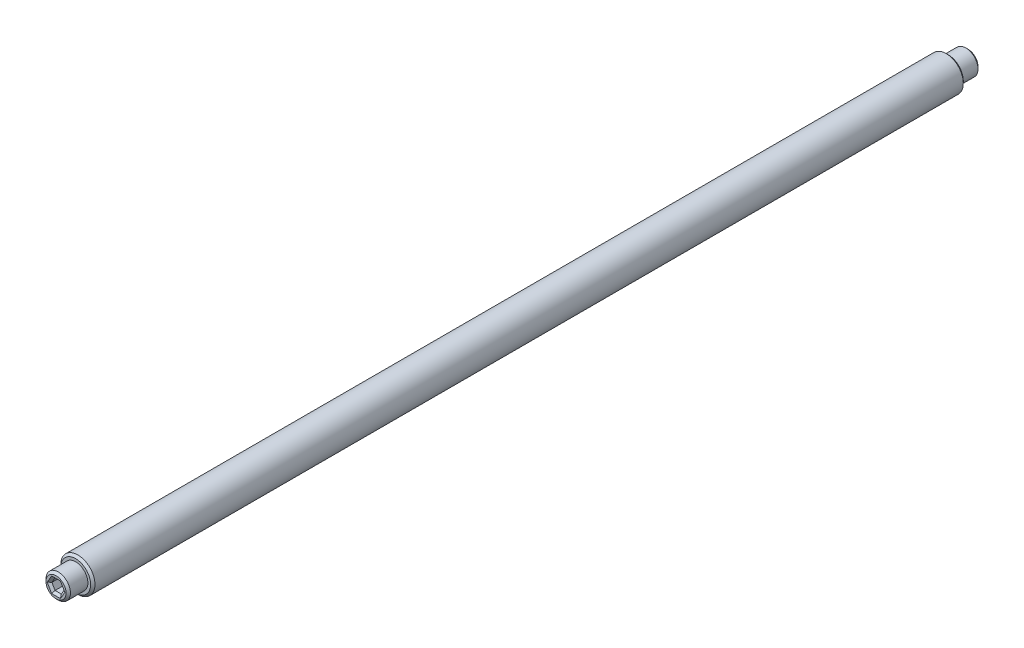
ISO-10303-21;
HEADER;
FILE_DESCRIPTION(('STEP AP214'),'2;1');
FILE_NAME('part.step','',(''),(''),'','','');
FILE_SCHEMA(('AUTOMOTIVE_DESIGN { 1 0 10303 214 1 1 1 1 }'));
ENDSEC;
DATA;
#1=APPLICATION_CONTEXT('core data for automotive mechanical design processes');
#2=APPLICATION_PROTOCOL_DEFINITION('international standard','automotive_design',2000,#1);
#3=PRODUCT_CONTEXT('',#1,'mechanical');
#4=PRODUCT('Part','Part','',(#3));
#5=PRODUCT_RELATED_PRODUCT_CATEGORY('part','',(#4));
#6=PRODUCT_DEFINITION_FORMATION('','',#4);
#7=PRODUCT_DEFINITION_CONTEXT('part definition',#1,'design');
#8=PRODUCT_DEFINITION('design','',#6,#7);
#9=PRODUCT_DEFINITION_SHAPE('','',#8);
#10=(LENGTH_UNIT() NAMED_UNIT(*) SI_UNIT(.MILLI.,.METRE.));
#11=(NAMED_UNIT(*) PLANE_ANGLE_UNIT() SI_UNIT($,.RADIAN.));
#12=(NAMED_UNIT(*) SI_UNIT($,.STERADIAN.) SOLID_ANGLE_UNIT());
#13=UNCERTAINTY_MEASURE_WITH_UNIT(LENGTH_MEASURE(1.E-05),#10,'distance_accuracy_value','');
#14=(GEOMETRIC_REPRESENTATION_CONTEXT(3) GLOBAL_UNCERTAINTY_ASSIGNED_CONTEXT((#13)) GLOBAL_UNIT_ASSIGNED_CONTEXT((#10,
#11,#12)) REPRESENTATION_CONTEXT('',''));
#15=CARTESIAN_POINT('',(0.,0.,0.));
#16=DIRECTION('',(0.,0.,1.));
#17=DIRECTION('',(1.,0.,0.));
#18=AXIS2_PLACEMENT_3D('',#15,#16,#17);
#19=CARTESIAN_POINT('',(-1.4224,0.,46.736));
#20=DIRECTION('',(0.,0.,1.));
#21=DIRECTION('',(0.,-1.,0.));
#22=AXIS2_PLACEMENT_3D('',#19,#20,#21);
#23=PLANE('',#22);
#24=CARTESIAN_POINT('',(0.,0.,46.736));
#25=DIRECTION('',(0.,0.,1.));
#26=DIRECTION('',(0.,-1.,0.));
#27=AXIS2_PLACEMENT_3D('',#24,#25,#26);
#28=CIRCLE('',#27,1.1684);
#29=CARTESIAN_POINT('',(0.,-1.1684,46.736));
#30=VERTEX_POINT('',#29);
#31=EDGE_CURVE('P0_E126',#30,#30,#28,.F.);
#32=ORIENTED_EDGE('',*,*,#31,.T.);
#33=EDGE_LOOP('',(#32));
#34=FACE_BOUND('',#33,.T.);
#35=ADVANCED_FACE('P0_F16',(#34),#23,.F.);
#36=CARTESIAN_POINT('',(0.,0.,53.086));
#37=DIRECTION('',(0.,0.,-1.));
#38=DIRECTION('',(0.,1.,0.));
#39=AXIS2_PLACEMENT_3D('',#36,#37,#38);
#40=PLANE('',#39);
#41=DIRECTION('',(0.5,-0.866025403784439,0.));
#42=VECTOR('',#41,1.);
#43=CARTESIAN_POINT('',(0.769896583964369,0.444499999999998,53.086));
#44=LINE('',#43,#42);
#45=CARTESIAN_POINT('',(0.513264389309577,0.889000000000003,53.086));
#46=VERTEX_POINT('',#45);
#47=CARTESIAN_POINT('',(1.02652877861916,0.,53.086));
#48=VERTEX_POINT('',#47);
#49=EDGE_CURVE('P0_E157',#46,#48,#44,.T.);
#50=ORIENTED_EDGE('',*,*,#49,.T.);
#51=DIRECTION('',(-0.5,-0.866025403784439,0.));
#52=VECTOR('',#51,1.);
#53=CARTESIAN_POINT('',(0.769896583964379,-0.444500000000007,53.086));
#54=LINE('',#53,#52);
#55=CARTESIAN_POINT('',(0.513264389309584,-0.889000000000008,53.086));
#56=VERTEX_POINT('',#55);
#57=EDGE_CURVE('P0_E159',#48,#56,#54,.T.);
#58=ORIENTED_EDGE('',*,*,#57,.T.);
#59=DIRECTION('',(-1.,0.,0.));
#60=VECTOR('',#59,1.);
#61=CARTESIAN_POINT('',(0.,-0.889000000000005,53.086));
#62=LINE('',#61,#60);
#63=CARTESIAN_POINT('',(-0.513264389309577,-0.889000000000001,53.086));
#64=VERTEX_POINT('',#63);
#65=EDGE_CURVE('P0_E149',#56,#64,#62,.T.);
#66=ORIENTED_EDGE('',*,*,#65,.T.);
#67=DIRECTION('',(-0.5,0.866025403784439,0.));
#68=VECTOR('',#67,1.);
#69=CARTESIAN_POINT('',(-0.769896583964343,-0.444500000000007,53.086));
#70=LINE('',#69,#68);
#71=CARTESIAN_POINT('',(-1.02652877861915,0.,53.086));
#72=VERTEX_POINT('',#71);
#73=EDGE_CURVE('P0_E151',#64,#72,#70,.T.);
#74=ORIENTED_EDGE('',*,*,#73,.T.);
#75=DIRECTION('',(0.5,0.866025403784439,0.));
#76=VECTOR('',#75,1.);
#77=CARTESIAN_POINT('',(-0.769896583964338,0.444499999999995,53.086));
#78=LINE('',#77,#76);
#79=CARTESIAN_POINT('',(-0.513264389309577,0.889000000000002,53.086));
#80=VERTEX_POINT('',#79);
#81=EDGE_CURVE('P0_E153',#72,#80,#78,.T.);
#82=ORIENTED_EDGE('',*,*,#81,.T.);
#83=DIRECTION('',(1.,0.,0.));
#84=VECTOR('',#83,1.);
#85=CARTESIAN_POINT('',(0.,0.888999999999998,53.086));
#86=LINE('',#85,#84);
#87=EDGE_CURVE('P0_E155',#80,#46,#86,.T.);
#88=ORIENTED_EDGE('',*,*,#87,.T.);
#89=EDGE_LOOP('',(#50,#58,#66,#74,#82,#88));
#90=FACE_BOUND('',#89,.T.);
#91=CARTESIAN_POINT('',(0.,0.,53.086));
#92=DIRECTION('',(0.,0.,-1.));
#93=DIRECTION('',(0.,1.,0.));
#94=AXIS2_PLACEMENT_3D('',#91,#92,#93);
#95=CIRCLE('',#94,1.1684);
#96=CARTESIAN_POINT('',(0.,1.1684,53.086));
#97=VERTEX_POINT('',#96);
#98=EDGE_CURVE('P0_E143',#97,#97,#95,.F.);
#99=ORIENTED_EDGE('',*,*,#98,.T.);
#100=EDGE_LOOP('',(#99));
#101=FACE_BOUND('',#100,.T.);
#102=ADVANCED_FACE('P0_F208',(#90,#101),#40,.F.);
#103=CARTESIAN_POINT('',(0.,0.,46.736));
#104=DIRECTION('',(0.,0.,-1.));
#105=DIRECTION('',(0.,1.,0.));
#106=AXIS2_PLACEMENT_3D('',#103,#104,#105);
#107=CYLINDRICAL_SURFACE('',#106,1.4224);
#108=CARTESIAN_POINT('',(0.,0.,46.99));
#109=DIRECTION('',(0.,0.,1.));
#110=DIRECTION('',(0.,-1.,0.));
#111=AXIS2_PLACEMENT_3D('',#108,#109,#110);
#112=CIRCLE('',#111,1.4224);
#113=CARTESIAN_POINT('',(0.,-1.4224,46.99));
#114=VERTEX_POINT('',#113);
#115=EDGE_CURVE('P0_E140',#114,#114,#112,.T.);
#116=ORIENTED_EDGE('',*,*,#115,.T.);
#117=EDGE_LOOP('',(#116));
#118=FACE_BOUND('',#117,.T.);
#119=CARTESIAN_POINT('',(0.,0.,52.832));
#120=DIRECTION('',(0.,0.,-1.));
#121=DIRECTION('',(0.,1.,0.));
#122=AXIS2_PLACEMENT_3D('',#119,#120,#121);
#123=CIRCLE('',#122,1.4224);
#124=CARTESIAN_POINT('',(0.,1.4224,52.832));
#125=VERTEX_POINT('',#124);
#126=EDGE_CURVE('P0_E137',#125,#125,#123,.T.);
#127=ORIENTED_EDGE('',*,*,#126,.T.);
#128=EDGE_LOOP('',(#127));
#129=FACE_BOUND('',#128,.T.);
#130=ADVANCED_FACE('P0_F211',(#118,#129),#107,.T.);
#131=CARTESIAN_POINT('',(0.,0.,46.736));
#132=DIRECTION('',(0.,0.,1.));
#133=DIRECTION('',(0.,-1.,0.));
#134=AXIS2_PLACEMENT_3D('',#131,#132,#133);
#135=CONICAL_SURFACE('',#134,1.1684,0.785398163397445);
#136=ORIENTED_EDGE('',*,*,#115,.F.);
#137=EDGE_LOOP('',(#136));
#138=FACE_BOUND('',#137,.T.);
#139=ORIENTED_EDGE('',*,*,#31,.F.);
#140=EDGE_LOOP('',(#139));
#141=FACE_BOUND('',#140,.T.);
#142=ADVANCED_FACE('P0_F218',(#138,#141),#135,.T.);
#143=CARTESIAN_POINT('',(0.,0.,52.832));
#144=DIRECTION('',(0.,0.,-1.));
#145=DIRECTION('',(0.,1.,0.));
#146=AXIS2_PLACEMENT_3D('',#143,#144,#145);
#147=CONICAL_SURFACE('',#146,1.4224,0.78539816339745);
#148=ORIENTED_EDGE('',*,*,#98,.F.);
#149=EDGE_LOOP('',(#148));
#150=FACE_BOUND('',#149,.T.);
#151=ORIENTED_EDGE('',*,*,#126,.F.);
#152=EDGE_LOOP('',(#151));
#153=FACE_BOUND('',#152,.T.);
#154=ADVANCED_FACE('P0_F215',(#150,#153),#147,.T.);
#155=CARTESIAN_POINT('',(0.733234841870836,0.,51.816));
#156=DIRECTION('',(0.866025403784439,0.5,0.));
#157=DIRECTION('',(-0.5,0.866025403784439,0.));
#158=AXIS2_PLACEMENT_3D('',#155,#156,#157);
#159=PLANE('',#158);
#160=DIRECTION('',(0.,0.,1.));
#161=VECTOR('',#160,1.);
#162=CARTESIAN_POINT('',(0.733234841870836,0.,51.816));
#163=LINE('',#162,#161);
#164=CARTESIAN_POINT('',(0.733234841870836,0.,51.816));
#165=VERTEX_POINT('',#164);
#166=CARTESIAN_POINT('',(0.733234841870836,0.,52.832));
#167=VERTEX_POINT('',#166);
#168=EDGE_CURVE('P0_E124',#165,#167,#163,.T.);
#169=ORIENTED_EDGE('',*,*,#168,.T.);
#170=DIRECTION('',(-0.5,0.866025403784439,0.));
#171=VECTOR('',#170,1.);
#172=CARTESIAN_POINT('',(0.733234841870836,0.,52.832));
#173=LINE('',#172,#171);
#174=CARTESIAN_POINT('',(0.366617420935418,0.635000000000004,52.832));
#175=VERTEX_POINT('',#174);
#176=EDGE_CURVE('P0_E96',#167,#175,#173,.T.);
#177=ORIENTED_EDGE('',*,*,#176,.T.);
#178=DIRECTION('',(0.,0.,1.));
#179=VECTOR('',#178,1.);
#180=CARTESIAN_POINT('',(0.366617420935418,0.635000000000004,51.816));
#181=LINE('',#180,#179);
#182=CARTESIAN_POINT('',(0.366617420935418,0.635000000000004,51.816));
#183=VERTEX_POINT('',#182);
#184=EDGE_CURVE('P0_E88',#183,#175,#181,.T.);
#185=ORIENTED_EDGE('',*,*,#184,.F.);
#186=DIRECTION('',(-0.5,0.866025403784439,0.));
#187=VECTOR('',#186,1.);
#188=CARTESIAN_POINT('',(0.733234841870836,0.,51.816));
#189=LINE('',#188,#187);
#190=EDGE_CURVE('P0_E93',#165,#183,#189,.T.);
#191=ORIENTED_EDGE('',*,*,#190,.F.);
#192=EDGE_LOOP('',(#169,#177,#185,#191));
#193=FACE_BOUND('',#192,.T.);
#194=ADVANCED_FACE('P0_F91',(#193),#159,.F.);
#195=CARTESIAN_POINT('',(0.366617420935415,-0.634999999999999,51.816));
#196=DIRECTION('',(0.866025403784439,-0.5,0.));
#197=DIRECTION('',(0.5,0.866025403784439,0.));
#198=AXIS2_PLACEMENT_3D('',#195,#196,#197);
#199=PLANE('',#198);
#200=DIRECTION('',(0.,0.,1.));
#201=VECTOR('',#200,1.);
#202=CARTESIAN_POINT('',(0.366617420935415,-0.634999999999999,51.816));
#203=LINE('',#202,#201);
#204=CARTESIAN_POINT('',(0.366617420935415,-0.634999999999999,51.816));
#205=VERTEX_POINT('',#204);
#206=CARTESIAN_POINT('',(0.366617420935415,-0.634999999999999,52.832));
#207=VERTEX_POINT('',#206);
#208=EDGE_CURVE('P0_E127',#205,#207,#203,.T.);
#209=ORIENTED_EDGE('',*,*,#208,.T.);
#210=DIRECTION('',(0.5,0.866025403784439,0.));
#211=VECTOR('',#210,1.);
#212=CARTESIAN_POINT('',(0.366617420935415,-0.634999999999999,52.832));
#213=LINE('',#212,#211);
#214=EDGE_CURVE('P0_E146',#207,#167,#213,.T.);
#215=ORIENTED_EDGE('',*,*,#214,.T.);
#216=ORIENTED_EDGE('',*,*,#168,.F.);
#217=DIRECTION('',(0.5,0.866025403784439,0.));
#218=VECTOR('',#217,1.);
#219=CARTESIAN_POINT('',(0.366617420935415,-0.634999999999999,51.816));
#220=LINE('',#219,#218);
#221=EDGE_CURVE('P0_E100',#205,#165,#220,.T.);
#222=ORIENTED_EDGE('',*,*,#221,.F.);
#223=EDGE_LOOP('',(#209,#215,#216,#222));
#224=FACE_BOUND('',#223,.T.);
#225=ADVANCED_FACE('P0_F199',(#224),#199,.F.);
#226=CARTESIAN_POINT('',(-0.366617420935404,-0.634999999999999,51.816));
#227=DIRECTION('',(0.,-1.,0.));
#228=DIRECTION('',(1.,0.,0.));
#229=AXIS2_PLACEMENT_3D('',#226,#227,#228);
#230=PLANE('',#229);
#231=DIRECTION('',(0.,0.,1.));
#232=VECTOR('',#231,1.);
#233=CARTESIAN_POINT('',(-0.366617420935404,-0.634999999999999,51.816));
#234=LINE('',#233,#232);
#235=CARTESIAN_POINT('',(-0.366617420935404,-0.634999999999999,51.816));
#236=VERTEX_POINT('',#235);
#237=CARTESIAN_POINT('',(-0.366617420935404,-0.634999999999999,52.832));
#238=VERTEX_POINT('',#237);
#239=EDGE_CURVE('P0_E130',#236,#238,#234,.T.);
#240=ORIENTED_EDGE('',*,*,#239,.T.);
#241=DIRECTION('',(1.,0.,0.));
#242=VECTOR('',#241,1.);
#243=CARTESIAN_POINT('',(-0.366617420935404,-0.634999999999999,52.832));
#244=LINE('',#243,#242);
#245=EDGE_CURVE('P0_E11',#238,#207,#244,.T.);
#246=ORIENTED_EDGE('',*,*,#245,.T.);
#247=ORIENTED_EDGE('',*,*,#208,.F.);
#248=DIRECTION('',(1.,0.,0.));
#249=VECTOR('',#248,1.);
#250=CARTESIAN_POINT('',(-0.366617420935404,-0.634999999999999,51.816));
#251=LINE('',#250,#249);
#252=EDGE_CURVE('P0_E121',#236,#205,#251,.T.);
#253=ORIENTED_EDGE('',*,*,#252,.F.);
#254=EDGE_LOOP('',(#240,#246,#247,#253));
#255=FACE_BOUND('',#254,.T.);
#256=ADVANCED_FACE('P0_F196',(#255),#230,.F.);
#257=CARTESIAN_POINT('',(-0.733234841870798,0.,51.816));
#258=DIRECTION('',(-0.866025403784439,-0.5,0.));
#259=DIRECTION('',(0.5,-0.866025403784439,0.));
#260=AXIS2_PLACEMENT_3D('',#257,#258,#259);
#261=PLANE('',#260);
#262=DIRECTION('',(0.,0.,1.));
#263=VECTOR('',#262,1.);
#264=CARTESIAN_POINT('',(-0.733234841870798,0.,51.816));
#265=LINE('',#264,#263);
#266=CARTESIAN_POINT('',(-0.733234841870798,0.,51.816));
#267=VERTEX_POINT('',#266);
#268=CARTESIAN_POINT('',(-0.733234841870798,0.,52.832));
#269=VERTEX_POINT('',#268);
#270=EDGE_CURVE('P0_E132',#267,#269,#265,.T.);
#271=ORIENTED_EDGE('',*,*,#270,.T.);
#272=DIRECTION('',(0.5,-0.866025403784439,0.));
#273=VECTOR('',#272,1.);
#274=CARTESIAN_POINT('',(-0.733234841870798,0.,52.832));
#275=LINE('',#274,#273);
#276=EDGE_CURVE('P0_E25',#269,#238,#275,.T.);
#277=ORIENTED_EDGE('',*,*,#276,.T.);
#278=ORIENTED_EDGE('',*,*,#239,.F.);
#279=DIRECTION('',(0.5,-0.866025403784439,0.));
#280=VECTOR('',#279,1.);
#281=CARTESIAN_POINT('',(-0.733234841870798,0.,51.816));
#282=LINE('',#281,#280);
#283=EDGE_CURVE('P0_E118',#267,#236,#282,.T.);
#284=ORIENTED_EDGE('',*,*,#283,.F.);
#285=EDGE_LOOP('',(#271,#277,#278,#284));
#286=FACE_BOUND('',#285,.T.);
#287=ADVANCED_FACE('P0_F263',(#286),#261,.F.);
#288=CARTESIAN_POINT('',(-0.366617420935404,0.635000000000002,51.816));
#289=DIRECTION('',(-0.866025403784439,0.5,0.));
#290=DIRECTION('',(-0.5,-0.866025403784439,0.));
#291=AXIS2_PLACEMENT_3D('',#288,#289,#290);
#292=PLANE('',#291);
#293=DIRECTION('',(0.,0.,1.));
#294=VECTOR('',#293,1.);
#295=CARTESIAN_POINT('',(-0.366617420935404,0.635000000000002,51.816));
#296=LINE('',#295,#294);
#297=CARTESIAN_POINT('',(-0.366617420935404,0.635000000000002,51.816));
#298=VERTEX_POINT('',#297);
#299=CARTESIAN_POINT('',(-0.366617420935404,0.635000000000002,52.832));
#300=VERTEX_POINT('',#299);
#301=EDGE_CURVE('P0_E99',#298,#300,#296,.T.);
#302=ORIENTED_EDGE('',*,*,#301,.T.);
#303=DIRECTION('',(-0.5,-0.866025403784439,0.));
#304=VECTOR('',#303,1.);
#305=CARTESIAN_POINT('',(-0.366617420935404,0.635000000000002,52.832));
#306=LINE('',#305,#304);
#307=EDGE_CURVE('P0_E40',#300,#269,#306,.T.);
#308=ORIENTED_EDGE('',*,*,#307,.T.);
#309=ORIENTED_EDGE('',*,*,#270,.F.);
#310=DIRECTION('',(-0.5,-0.866025403784439,0.));
#311=VECTOR('',#310,1.);
#312=CARTESIAN_POINT('',(-0.366617420935404,0.635000000000002,51.816));
#313=LINE('',#312,#311);
#314=EDGE_CURVE('P0_E108',#298,#267,#313,.T.);
#315=ORIENTED_EDGE('',*,*,#314,.F.);
#316=EDGE_LOOP('',(#302,#308,#309,#315));
#317=FACE_BOUND('',#316,.T.);
#318=ADVANCED_FACE('P0_F256',(#317),#292,.F.);
#319=CARTESIAN_POINT('',(0.366617420935418,0.635000000000004,51.816));
#320=DIRECTION('',(0.,1.,0.));
#321=DIRECTION('',(-1.,0.,0.));
#322=AXIS2_PLACEMENT_3D('',#319,#320,#321);
#323=PLANE('',#322);
#324=ORIENTED_EDGE('',*,*,#184,.T.);
#325=DIRECTION('',(-1.,0.,0.));
#326=VECTOR('',#325,1.);
#327=CARTESIAN_POINT('',(0.366617420935418,0.635000000000004,52.832));
#328=LINE('',#327,#326);
#329=EDGE_CURVE('P0_E163',#175,#300,#328,.T.);
#330=ORIENTED_EDGE('',*,*,#329,.T.);
#331=ORIENTED_EDGE('',*,*,#301,.F.);
#332=DIRECTION('',(-1.,0.,0.));
#333=VECTOR('',#332,1.);
#334=CARTESIAN_POINT('',(0.366617420935418,0.635000000000004,51.816));
#335=LINE('',#334,#333);
#336=EDGE_CURVE('P0_E103',#183,#298,#335,.T.);
#337=ORIENTED_EDGE('',*,*,#336,.F.);
#338=EDGE_LOOP('',(#324,#330,#331,#337));
#339=FACE_BOUND('',#338,.T.);
#340=ADVANCED_FACE('P0_F104',(#339),#323,.F.);
#341=CARTESIAN_POINT('',(1.09985226280624,-0.635000000000004,51.816));
#342=DIRECTION('',(0.,0.,-1.));
#343=DIRECTION('',(0.,1.,0.));
#344=AXIS2_PLACEMENT_3D('',#341,#342,#343);
#345=PLANE('',#344);
#346=ORIENTED_EDGE('',*,*,#190,.T.);
#347=ORIENTED_EDGE('',*,*,#336,.T.);
#348=ORIENTED_EDGE('',*,*,#314,.T.);
#349=ORIENTED_EDGE('',*,*,#283,.T.);
#350=ORIENTED_EDGE('',*,*,#252,.T.);
#351=ORIENTED_EDGE('',*,*,#221,.T.);
#352=EDGE_LOOP('',(#346,#347,#348,#349,#350,#351));
#353=FACE_BOUND('',#352,.T.);
#354=ADVANCED_FACE('P0_F110',(#353),#345,.F.);
#355=CARTESIAN_POINT('',(-0.366617420935404,0.635000000000002,52.832));
#356=DIRECTION('',(-0.612372435695793,0.353553390593273,-0.707106781186549));
#357=DIRECTION('',(0.755928946018456,0.,-0.654653670707976));
#358=AXIS2_PLACEMENT_3D('',#355,#356,#357);
#359=PLANE('',#358);
#360=DIRECTION('',(-0.377964473009228,0.654653670707978,0.654653670707976));
#361=VECTOR('',#360,1.);
#362=CARTESIAN_POINT('',(-0.261869586382434,0.453571428571433,52.6505714285714));
#363=LINE('',#362,#361);
#364=EDGE_CURVE('P0_E115',#80,#300,#363,.F.);
#365=ORIENTED_EDGE('',*,*,#364,.F.);
#366=ORIENTED_EDGE('',*,*,#81,.F.);
#367=DIRECTION('',(-0.755928946018456,0.,0.654653670707976));
#368=VECTOR('',#367,1.);
#369=CARTESIAN_POINT('',(-0.523739172764874,0.,52.6505714285714));
#370=LINE('',#369,#368);
#371=EDGE_CURVE('P0_E20',#269,#72,#370,.T.);
#372=ORIENTED_EDGE('',*,*,#371,.F.);
#373=ORIENTED_EDGE('',*,*,#307,.F.);
#374=EDGE_LOOP('',(#365,#366,#372,#373));
#375=FACE_BOUND('',#374,.T.);
#376=ADVANCED_FACE('P0_F18',(#375),#359,.F.);
#377=CARTESIAN_POINT('',(-0.733234841870798,0.,52.832));
#378=DIRECTION('',(-0.612372435695794,-0.353553390593273,-0.707106781186549));
#379=DIRECTION('',(0.755928946018456,0.,-0.654653670707976));
#380=AXIS2_PLACEMENT_3D('',#377,#378,#379);
#381=PLANE('',#380);
#382=ORIENTED_EDGE('',*,*,#371,.T.);
#383=ORIENTED_EDGE('',*,*,#73,.F.);
#384=DIRECTION('',(-0.377964473009228,-0.654653670707978,0.654653670707976));
#385=VECTOR('',#384,1.);
#386=CARTESIAN_POINT('',(-0.261869586382434,-0.453571428571428,52.6505714285714));
#387=LINE('',#386,#385);
#388=EDGE_CURVE('P0_E174',#238,#64,#387,.T.);
#389=ORIENTED_EDGE('',*,*,#388,.F.);
#390=ORIENTED_EDGE('',*,*,#276,.F.);
#391=EDGE_LOOP('',(#382,#383,#389,#390));
#392=FACE_BOUND('',#391,.T.);
#393=ADVANCED_FACE('P0_F188',(#392),#381,.F.);
#394=CARTESIAN_POINT('',(0.366617420935418,0.635000000000004,52.832));
#395=DIRECTION('',(0.,0.707106781186546,-0.707106781186549));
#396=DIRECTION('',(0.,0.707106781186549,0.707106781186546));
#397=AXIS2_PLACEMENT_3D('',#394,#395,#396);
#398=PLANE('',#397);
#399=ORIENTED_EDGE('',*,*,#364,.T.);
#400=ORIENTED_EDGE('',*,*,#329,.F.);
#401=DIRECTION('',(0.377964473009228,0.654653670707979,0.654653670707976));
#402=VECTOR('',#401,1.);
#403=CARTESIAN_POINT('',(0.261869586382444,0.453571428571428,52.6505714285714));
#404=LINE('',#403,#402);
#405=EDGE_CURVE('P0_E171',#46,#175,#404,.F.);
#406=ORIENTED_EDGE('',*,*,#405,.F.);
#407=ORIENTED_EDGE('',*,*,#87,.F.);
#408=EDGE_LOOP('',(#399,#400,#406,#407));
#409=FACE_BOUND('',#408,.T.);
#410=ADVANCED_FACE('P0_F180',(#409),#398,.F.);
#411=CARTESIAN_POINT('',(-0.366617420935404,-0.634999999999999,52.832));
#412=DIRECTION('',(0.,-0.707106781186546,-0.707106781186549));
#413=DIRECTION('',(0.,0.707106781186549,-0.707106781186546));
#414=AXIS2_PLACEMENT_3D('',#411,#412,#413);
#415=PLANE('',#414);
#416=ORIENTED_EDGE('',*,*,#388,.T.);
#417=ORIENTED_EDGE('',*,*,#65,.F.);
#418=DIRECTION('',(-0.377964473009228,0.654653670707978,-0.654653670707976));
#419=VECTOR('',#418,1.);
#420=CARTESIAN_POINT('',(0.366617420935415,-0.634999999999999,52.832));
#421=LINE('',#420,#419);
#422=EDGE_CURVE('P0_E169',#207,#56,#421,.F.);
#423=ORIENTED_EDGE('',*,*,#422,.F.);
#424=ORIENTED_EDGE('',*,*,#245,.F.);
#425=EDGE_LOOP('',(#416,#417,#423,#424));
#426=FACE_BOUND('',#425,.T.);
#427=ADVANCED_FACE('P0_F193',(#426),#415,.F.);
#428=CARTESIAN_POINT('',(0.733234841870836,0.,52.832));
#429=DIRECTION('',(0.612372435695793,0.353553390593273,-0.707106781186549));
#430=DIRECTION('',(0.755928946018456,0.,0.654653670707976));
#431=AXIS2_PLACEMENT_3D('',#428,#429,#430);
#432=PLANE('',#431);
#433=ORIENTED_EDGE('',*,*,#405,.T.);
#434=ORIENTED_EDGE('',*,*,#176,.F.);
#435=DIRECTION('',(0.755928946018456,0.,0.654653670707976));
#436=VECTOR('',#435,1.);
#437=CARTESIAN_POINT('',(0.523739172764874,0.,52.6505714285714));
#438=LINE('',#437,#436);
#439=EDGE_CURVE('P0_E167',#48,#167,#438,.F.);
#440=ORIENTED_EDGE('',*,*,#439,.F.);
#441=ORIENTED_EDGE('',*,*,#49,.F.);
#442=EDGE_LOOP('',(#433,#434,#440,#441));
#443=FACE_BOUND('',#442,.T.);
#444=ADVANCED_FACE('P0_F206',(#443),#432,.F.);
#445=CARTESIAN_POINT('',(0.366617420935415,-0.634999999999999,52.832));
#446=DIRECTION('',(0.612372435695794,-0.353553390593273,-0.707106781186549));
#447=DIRECTION('',(0.755928946018456,0.,0.654653670707976));
#448=AXIS2_PLACEMENT_3D('',#445,#446,#447);
#449=PLANE('',#448);
#450=ORIENTED_EDGE('',*,*,#422,.T.);
#451=ORIENTED_EDGE('',*,*,#57,.F.);
#452=ORIENTED_EDGE('',*,*,#439,.T.);
#453=ORIENTED_EDGE('',*,*,#214,.F.);
#454=EDGE_LOOP('',(#450,#451,#452,#453));
#455=FACE_BOUND('',#454,.T.);
#456=ADVANCED_FACE('P0_F201',(#455),#449,.F.);
#457=CLOSED_SHELL('',(#35,#102,#130,#142,#154,#194,#225,#256,#287,#318,#340,#354,#376,#393,#410,
#427,#444,#456));
#458=MANIFOLD_SOLID_BREP('P0_B1',#457);
#459=CARTESIAN_POINT('',(-1.4224,0.,-46.736));
#460=DIRECTION('',(0.,0.,-1.));
#461=DIRECTION('',(0.,1.,0.));
#462=AXIS2_PLACEMENT_3D('',#459,#460,#461);
#463=PLANE('',#462);
#464=CARTESIAN_POINT('',(0.,0.,-46.736));
#465=DIRECTION('',(0.,0.,-1.));
#466=DIRECTION('',(0.,1.,0.));
#467=AXIS2_PLACEMENT_3D('',#464,#465,#466);
#468=CIRCLE('',#467,1.1684);
#469=CARTESIAN_POINT('',(0.,1.1684,-46.736));
#470=VERTEX_POINT('',#469);
#471=EDGE_CURVE('P1_E126',#470,#470,#468,.F.);
#472=ORIENTED_EDGE('',*,*,#471,.T.);
#473=EDGE_LOOP('',(#472));
#474=FACE_BOUND('',#473,.T.);
#475=ADVANCED_FACE('P1_F16',(#474),#463,.F.);
#476=CARTESIAN_POINT('',(0.,0.,-53.086));
#477=DIRECTION('',(0.,0.,1.));
#478=DIRECTION('',(0.,-1.,0.));
#479=AXIS2_PLACEMENT_3D('',#476,#477,#478);
#480=PLANE('',#479);
#481=DIRECTION('',(0.5,0.866025403784439,0.));
#482=VECTOR('',#481,1.);
#483=CARTESIAN_POINT('',(0.769896583964369,-0.444499999999998,-53.086));
#484=LINE('',#483,#482);
#485=CARTESIAN_POINT('',(0.513264389309577,-0.889000000000003,-53.086));
#486=VERTEX_POINT('',#485);
#487=CARTESIAN_POINT('',(1.02652877861916,0.,-53.086));
#488=VERTEX_POINT('',#487);
#489=EDGE_CURVE('P1_E157',#486,#488,#484,.T.);
#490=ORIENTED_EDGE('',*,*,#489,.T.);
#491=DIRECTION('',(-0.5,0.866025403784439,0.));
#492=VECTOR('',#491,1.);
#493=CARTESIAN_POINT('',(0.769896583964379,0.444500000000007,-53.086));
#494=LINE('',#493,#492);
#495=CARTESIAN_POINT('',(0.513264389309584,0.889000000000008,-53.086));
#496=VERTEX_POINT('',#495);
#497=EDGE_CURVE('P1_E159',#488,#496,#494,.T.);
#498=ORIENTED_EDGE('',*,*,#497,.T.);
#499=DIRECTION('',(-1.,0.,0.));
#500=VECTOR('',#499,1.);
#501=CARTESIAN_POINT('',(0.,0.889000000000005,-53.086));
#502=LINE('',#501,#500);
#503=CARTESIAN_POINT('',(-0.513264389309577,0.889000000000001,-53.086));
#504=VERTEX_POINT('',#503);
#505=EDGE_CURVE('P1_E149',#496,#504,#502,.T.);
#506=ORIENTED_EDGE('',*,*,#505,.T.);
#507=DIRECTION('',(-0.5,-0.866025403784439,0.));
#508=VECTOR('',#507,1.);
#509=CARTESIAN_POINT('',(-0.769896583964343,0.444500000000007,-53.086));
#510=LINE('',#509,#508);
#511=CARTESIAN_POINT('',(-1.02652877861915,0.,-53.086));
#512=VERTEX_POINT('',#511);
#513=EDGE_CURVE('P1_E151',#504,#512,#510,.T.);
#514=ORIENTED_EDGE('',*,*,#513,.T.);
#515=DIRECTION('',(0.5,-0.866025403784439,0.));
#516=VECTOR('',#515,1.);
#517=CARTESIAN_POINT('',(-0.769896583964338,-0.444499999999995,-53.086));
#518=LINE('',#517,#516);
#519=CARTESIAN_POINT('',(-0.513264389309577,-0.889000000000002,-53.086));
#520=VERTEX_POINT('',#519);
#521=EDGE_CURVE('P1_E153',#512,#520,#518,.T.);
#522=ORIENTED_EDGE('',*,*,#521,.T.);
#523=DIRECTION('',(1.,0.,0.));
#524=VECTOR('',#523,1.);
#525=CARTESIAN_POINT('',(0.,-0.888999999999998,-53.086));
#526=LINE('',#525,#524);
#527=EDGE_CURVE('P1_E155',#520,#486,#526,.T.);
#528=ORIENTED_EDGE('',*,*,#527,.T.);
#529=EDGE_LOOP('',(#490,#498,#506,#514,#522,#528));
#530=FACE_BOUND('',#529,.T.);
#531=CARTESIAN_POINT('',(0.,0.,-53.086));
#532=DIRECTION('',(0.,0.,1.));
#533=DIRECTION('',(0.,-1.,0.));
#534=AXIS2_PLACEMENT_3D('',#531,#532,#533);
#535=CIRCLE('',#534,1.1684);
#536=CARTESIAN_POINT('',(0.,-1.1684,-53.086));
#537=VERTEX_POINT('',#536);
#538=EDGE_CURVE('P1_E143',#537,#537,#535,.F.);
#539=ORIENTED_EDGE('',*,*,#538,.T.);
#540=EDGE_LOOP('',(#539));
#541=FACE_BOUND('',#540,.T.);
#542=ADVANCED_FACE('P1_F208',(#530,#541),#480,.F.);
#543=CARTESIAN_POINT('',(0.,0.,-46.736));
#544=DIRECTION('',(0.,0.,1.));
#545=DIRECTION('',(0.,-1.,0.));
#546=AXIS2_PLACEMENT_3D('',#543,#544,#545);
#547=CYLINDRICAL_SURFACE('',#546,1.4224);
#548=CARTESIAN_POINT('',(0.,0.,-46.99));
#549=DIRECTION('',(0.,0.,-1.));
#550=DIRECTION('',(0.,1.,0.));
#551=AXIS2_PLACEMENT_3D('',#548,#549,#550);
#552=CIRCLE('',#551,1.4224);
#553=CARTESIAN_POINT('',(0.,1.4224,-46.99));
#554=VERTEX_POINT('',#553);
#555=EDGE_CURVE('P1_E140',#554,#554,#552,.T.);
#556=ORIENTED_EDGE('',*,*,#555,.T.);
#557=EDGE_LOOP('',(#556));
#558=FACE_BOUND('',#557,.T.);
#559=CARTESIAN_POINT('',(0.,0.,-52.832));
#560=DIRECTION('',(0.,0.,1.));
#561=DIRECTION('',(0.,-1.,0.));
#562=AXIS2_PLACEMENT_3D('',#559,#560,#561);
#563=CIRCLE('',#562,1.4224);
#564=CARTESIAN_POINT('',(0.,-1.4224,-52.832));
#565=VERTEX_POINT('',#564);
#566=EDGE_CURVE('P1_E137',#565,#565,#563,.T.);
#567=ORIENTED_EDGE('',*,*,#566,.T.);
#568=EDGE_LOOP('',(#567));
#569=FACE_BOUND('',#568,.T.);
#570=ADVANCED_FACE('P1_F211',(#558,#569),#547,.T.);
#571=CARTESIAN_POINT('',(0.,0.,-46.736));
#572=DIRECTION('',(0.,0.,-1.));
#573=DIRECTION('',(0.,1.,0.));
#574=AXIS2_PLACEMENT_3D('',#571,#572,#573);
#575=CONICAL_SURFACE('',#574,1.1684,0.785398163397445);
#576=ORIENTED_EDGE('',*,*,#555,.F.);
#577=EDGE_LOOP('',(#576));
#578=FACE_BOUND('',#577,.T.);
#579=ORIENTED_EDGE('',*,*,#471,.F.);
#580=EDGE_LOOP('',(#579));
#581=FACE_BOUND('',#580,.T.);
#582=ADVANCED_FACE('P1_F218',(#578,#581),#575,.T.);
#583=CARTESIAN_POINT('',(0.,0.,-52.832));
#584=DIRECTION('',(0.,0.,1.));
#585=DIRECTION('',(0.,-1.,0.));
#586=AXIS2_PLACEMENT_3D('',#583,#584,#585);
#587=CONICAL_SURFACE('',#586,1.4224,0.78539816339745);
#588=ORIENTED_EDGE('',*,*,#538,.F.);
#589=EDGE_LOOP('',(#588));
#590=FACE_BOUND('',#589,.T.);
#591=ORIENTED_EDGE('',*,*,#566,.F.);
#592=EDGE_LOOP('',(#591));
#593=FACE_BOUND('',#592,.T.);
#594=ADVANCED_FACE('P1_F215',(#590,#593),#587,.T.);
#595=CARTESIAN_POINT('',(0.733234841870836,0.,-51.816));
#596=DIRECTION('',(0.866025403784439,-0.5,0.));
#597=DIRECTION('',(-0.5,-0.866025403784439,0.));
#598=AXIS2_PLACEMENT_3D('',#595,#596,#597);
#599=PLANE('',#598);
#600=DIRECTION('',(0.,0.,-1.));
#601=VECTOR('',#600,1.);
#602=CARTESIAN_POINT('',(0.733234841870836,0.,-51.816));
#603=LINE('',#602,#601);
#604=CARTESIAN_POINT('',(0.733234841870836,0.,-51.816));
#605=VERTEX_POINT('',#604);
#606=CARTESIAN_POINT('',(0.733234841870836,0.,-52.832));
#607=VERTEX_POINT('',#606);
#608=EDGE_CURVE('P1_E124',#605,#607,#603,.T.);
#609=ORIENTED_EDGE('',*,*,#608,.T.);
#610=DIRECTION('',(-0.5,-0.866025403784439,0.));
#611=VECTOR('',#610,1.);
#612=CARTESIAN_POINT('',(0.733234841870836,0.,-52.832));
#613=LINE('',#612,#611);
#614=CARTESIAN_POINT('',(0.366617420935418,-0.635000000000004,-52.832));
#615=VERTEX_POINT('',#614);
#616=EDGE_CURVE('P1_E96',#607,#615,#613,.T.);
#617=ORIENTED_EDGE('',*,*,#616,.T.);
#618=DIRECTION('',(0.,0.,-1.));
#619=VECTOR('',#618,1.);
#620=CARTESIAN_POINT('',(0.366617420935418,-0.635000000000004,-51.816));
#621=LINE('',#620,#619);
#622=CARTESIAN_POINT('',(0.366617420935418,-0.635000000000004,-51.816));
#623=VERTEX_POINT('',#622);
#624=EDGE_CURVE('P1_E88',#623,#615,#621,.T.);
#625=ORIENTED_EDGE('',*,*,#624,.F.);
#626=DIRECTION('',(-0.5,-0.866025403784439,0.));
#627=VECTOR('',#626,1.);
#628=CARTESIAN_POINT('',(0.733234841870836,0.,-51.816));
#629=LINE('',#628,#627);
#630=EDGE_CURVE('P1_E93',#605,#623,#629,.T.);
#631=ORIENTED_EDGE('',*,*,#630,.F.);
#632=EDGE_LOOP('',(#609,#617,#625,#631));
#633=FACE_BOUND('',#632,.T.);
#634=ADVANCED_FACE('P1_F91',(#633),#599,.F.);
#635=CARTESIAN_POINT('',(0.366617420935415,0.634999999999999,-51.816));
#636=DIRECTION('',(0.866025403784439,0.5,0.));
#637=DIRECTION('',(0.5,-0.866025403784439,0.));
#638=AXIS2_PLACEMENT_3D('',#635,#636,#637);
#639=PLANE('',#638);
#640=DIRECTION('',(0.,0.,-1.));
#641=VECTOR('',#640,1.);
#642=CARTESIAN_POINT('',(0.366617420935415,0.634999999999999,-51.816));
#643=LINE('',#642,#641);
#644=CARTESIAN_POINT('',(0.366617420935415,0.634999999999999,-51.816));
#645=VERTEX_POINT('',#644);
#646=CARTESIAN_POINT('',(0.366617420935415,0.634999999999999,-52.832));
#647=VERTEX_POINT('',#646);
#648=EDGE_CURVE('P1_E127',#645,#647,#643,.T.);
#649=ORIENTED_EDGE('',*,*,#648,.T.);
#650=DIRECTION('',(0.5,-0.866025403784439,0.));
#651=VECTOR('',#650,1.);
#652=CARTESIAN_POINT('',(0.366617420935415,0.634999999999999,-52.832));
#653=LINE('',#652,#651);
#654=EDGE_CURVE('P1_E146',#647,#607,#653,.T.);
#655=ORIENTED_EDGE('',*,*,#654,.T.);
#656=ORIENTED_EDGE('',*,*,#608,.F.);
#657=DIRECTION('',(0.5,-0.866025403784439,0.));
#658=VECTOR('',#657,1.);
#659=CARTESIAN_POINT('',(0.366617420935415,0.634999999999999,-51.816));
#660=LINE('',#659,#658);
#661=EDGE_CURVE('P1_E100',#645,#605,#660,.T.);
#662=ORIENTED_EDGE('',*,*,#661,.F.);
#663=EDGE_LOOP('',(#649,#655,#656,#662));
#664=FACE_BOUND('',#663,.T.);
#665=ADVANCED_FACE('P1_F199',(#664),#639,.F.);
#666=CARTESIAN_POINT('',(-0.366617420935404,0.634999999999999,-51.816));
#667=DIRECTION('',(0.,1.,0.));
#668=DIRECTION('',(1.,0.,0.));
#669=AXIS2_PLACEMENT_3D('',#666,#667,#668);
#670=PLANE('',#669);
#671=DIRECTION('',(0.,0.,-1.));
#672=VECTOR('',#671,1.);
#673=CARTESIAN_POINT('',(-0.366617420935404,0.634999999999999,-51.816));
#674=LINE('',#673,#672);
#675=CARTESIAN_POINT('',(-0.366617420935404,0.634999999999999,-51.816));
#676=VERTEX_POINT('',#675);
#677=CARTESIAN_POINT('',(-0.366617420935404,0.634999999999999,-52.832));
#678=VERTEX_POINT('',#677);
#679=EDGE_CURVE('P1_E130',#676,#678,#674,.T.);
#680=ORIENTED_EDGE('',*,*,#679,.T.);
#681=DIRECTION('',(1.,0.,0.));
#682=VECTOR('',#681,1.);
#683=CARTESIAN_POINT('',(-0.366617420935404,0.634999999999999,-52.832));
#684=LINE('',#683,#682);
#685=EDGE_CURVE('P1_E11',#678,#647,#684,.T.);
#686=ORIENTED_EDGE('',*,*,#685,.T.);
#687=ORIENTED_EDGE('',*,*,#648,.F.);
#688=DIRECTION('',(1.,0.,0.));
#689=VECTOR('',#688,1.);
#690=CARTESIAN_POINT('',(-0.366617420935404,0.634999999999999,-51.816));
#691=LINE('',#690,#689);
#692=EDGE_CURVE('P1_E121',#676,#645,#691,.T.);
#693=ORIENTED_EDGE('',*,*,#692,.F.);
#694=EDGE_LOOP('',(#680,#686,#687,#693));
#695=FACE_BOUND('',#694,.T.);
#696=ADVANCED_FACE('P1_F196',(#695),#670,.F.);
#697=CARTESIAN_POINT('',(-0.733234841870798,0.,-51.816));
#698=DIRECTION('',(-0.866025403784439,0.5,0.));
#699=DIRECTION('',(0.5,0.866025403784439,0.));
#700=AXIS2_PLACEMENT_3D('',#697,#698,#699);
#701=PLANE('',#700);
#702=DIRECTION('',(0.,0.,-1.));
#703=VECTOR('',#702,1.);
#704=CARTESIAN_POINT('',(-0.733234841870798,0.,-51.816));
#705=LINE('',#704,#703);
#706=CARTESIAN_POINT('',(-0.733234841870798,0.,-51.816));
#707=VERTEX_POINT('',#706);
#708=CARTESIAN_POINT('',(-0.733234841870798,0.,-52.832));
#709=VERTEX_POINT('',#708);
#710=EDGE_CURVE('P1_E132',#707,#709,#705,.T.);
#711=ORIENTED_EDGE('',*,*,#710,.T.);
#712=DIRECTION('',(0.5,0.866025403784439,0.));
#713=VECTOR('',#712,1.);
#714=CARTESIAN_POINT('',(-0.733234841870798,0.,-52.832));
#715=LINE('',#714,#713);
#716=EDGE_CURVE('P1_E25',#709,#678,#715,.T.);
#717=ORIENTED_EDGE('',*,*,#716,.T.);
#718=ORIENTED_EDGE('',*,*,#679,.F.);
#719=DIRECTION('',(0.5,0.866025403784439,0.));
#720=VECTOR('',#719,1.);
#721=CARTESIAN_POINT('',(-0.733234841870798,0.,-51.816));
#722=LINE('',#721,#720);
#723=EDGE_CURVE('P1_E118',#707,#676,#722,.T.);
#724=ORIENTED_EDGE('',*,*,#723,.F.);
#725=EDGE_LOOP('',(#711,#717,#718,#724));
#726=FACE_BOUND('',#725,.T.);
#727=ADVANCED_FACE('P1_F263',(#726),#701,.F.);
#728=CARTESIAN_POINT('',(-0.366617420935404,-0.635000000000002,-51.816));
#729=DIRECTION('',(-0.866025403784439,-0.5,0.));
#730=DIRECTION('',(-0.5,0.866025403784439,0.));
#731=AXIS2_PLACEMENT_3D('',#728,#729,#730);
#732=PLANE('',#731);
#733=DIRECTION('',(0.,0.,-1.));
#734=VECTOR('',#733,1.);
#735=CARTESIAN_POINT('',(-0.366617420935404,-0.635000000000002,-51.816));
#736=LINE('',#735,#734);
#737=CARTESIAN_POINT('',(-0.366617420935404,-0.635000000000002,-51.816));
#738=VERTEX_POINT('',#737);
#739=CARTESIAN_POINT('',(-0.366617420935404,-0.635000000000002,-52.832));
#740=VERTEX_POINT('',#739);
#741=EDGE_CURVE('P1_E99',#738,#740,#736,.T.);
#742=ORIENTED_EDGE('',*,*,#741,.T.);
#743=DIRECTION('',(-0.5,0.866025403784439,0.));
#744=VECTOR('',#743,1.);
#745=CARTESIAN_POINT('',(-0.366617420935404,-0.635000000000002,-52.832));
#746=LINE('',#745,#744);
#747=EDGE_CURVE('P1_E40',#740,#709,#746,.T.);
#748=ORIENTED_EDGE('',*,*,#747,.T.);
#749=ORIENTED_EDGE('',*,*,#710,.F.);
#750=DIRECTION('',(-0.5,0.866025403784439,0.));
#751=VECTOR('',#750,1.);
#752=CARTESIAN_POINT('',(-0.366617420935404,-0.635000000000002,-51.816));
#753=LINE('',#752,#751);
#754=EDGE_CURVE('P1_E108',#738,#707,#753,.T.);
#755=ORIENTED_EDGE('',*,*,#754,.F.);
#756=EDGE_LOOP('',(#742,#748,#749,#755));
#757=FACE_BOUND('',#756,.T.);
#758=ADVANCED_FACE('P1_F256',(#757),#732,.F.);
#759=CARTESIAN_POINT('',(0.366617420935418,-0.635000000000004,-51.816));
#760=DIRECTION('',(0.,-1.,0.));
#761=DIRECTION('',(-1.,0.,0.));
#762=AXIS2_PLACEMENT_3D('',#759,#760,#761);
#763=PLANE('',#762);
#764=ORIENTED_EDGE('',*,*,#624,.T.);
#765=DIRECTION('',(-1.,0.,0.));
#766=VECTOR('',#765,1.);
#767=CARTESIAN_POINT('',(0.366617420935418,-0.635000000000004,-52.832));
#768=LINE('',#767,#766);
#769=EDGE_CURVE('P1_E163',#615,#740,#768,.T.);
#770=ORIENTED_EDGE('',*,*,#769,.T.);
#771=ORIENTED_EDGE('',*,*,#741,.F.);
#772=DIRECTION('',(-1.,0.,0.));
#773=VECTOR('',#772,1.);
#774=CARTESIAN_POINT('',(0.366617420935418,-0.635000000000004,-51.816));
#775=LINE('',#774,#773);
#776=EDGE_CURVE('P1_E103',#623,#738,#775,.T.);
#777=ORIENTED_EDGE('',*,*,#776,.F.);
#778=EDGE_LOOP('',(#764,#770,#771,#777));
#779=FACE_BOUND('',#778,.T.);
#780=ADVANCED_FACE('P1_F104',(#779),#763,.F.);
#781=CARTESIAN_POINT('',(1.09985226280624,0.635000000000004,-51.816));
#782=DIRECTION('',(0.,0.,1.));
#783=DIRECTION('',(0.,-1.,0.));
#784=AXIS2_PLACEMENT_3D('',#781,#782,#783);
#785=PLANE('',#784);
#786=ORIENTED_EDGE('',*,*,#630,.T.);
#787=ORIENTED_EDGE('',*,*,#776,.T.);
#788=ORIENTED_EDGE('',*,*,#754,.T.);
#789=ORIENTED_EDGE('',*,*,#723,.T.);
#790=ORIENTED_EDGE('',*,*,#692,.T.);
#791=ORIENTED_EDGE('',*,*,#661,.T.);
#792=EDGE_LOOP('',(#786,#787,#788,#789,#790,#791));
#793=FACE_BOUND('',#792,.T.);
#794=ADVANCED_FACE('P1_F110',(#793),#785,.F.);
#795=CARTESIAN_POINT('',(-0.366617420935404,-0.635000000000002,-52.832));
#796=DIRECTION('',(-0.612372435695793,-0.353553390593273,0.707106781186549));
#797=DIRECTION('',(0.755928946018456,0.,0.654653670707976));
#798=AXIS2_PLACEMENT_3D('',#795,#796,#797);
#799=PLANE('',#798);
#800=DIRECTION('',(-0.377964473009228,-0.654653670707978,-0.654653670707976));
#801=VECTOR('',#800,1.);
#802=CARTESIAN_POINT('',(-0.261869586382434,-0.453571428571433,-52.6505714285714));
#803=LINE('',#802,#801);
#804=EDGE_CURVE('P1_E115',#520,#740,#803,.F.);
#805=ORIENTED_EDGE('',*,*,#804,.F.);
#806=ORIENTED_EDGE('',*,*,#521,.F.);
#807=DIRECTION('',(-0.755928946018456,0.,-0.654653670707976));
#808=VECTOR('',#807,1.);
#809=CARTESIAN_POINT('',(-0.523739172764874,0.,-52.6505714285714));
#810=LINE('',#809,#808);
#811=EDGE_CURVE('P1_E20',#709,#512,#810,.T.);
#812=ORIENTED_EDGE('',*,*,#811,.F.);
#813=ORIENTED_EDGE('',*,*,#747,.F.);
#814=EDGE_LOOP('',(#805,#806,#812,#813));
#815=FACE_BOUND('',#814,.T.);
#816=ADVANCED_FACE('P1_F18',(#815),#799,.F.);
#817=CARTESIAN_POINT('',(-0.733234841870798,0.,-52.832));
#818=DIRECTION('',(-0.612372435695794,0.353553390593273,0.707106781186549));
#819=DIRECTION('',(0.755928946018456,0.,0.654653670707976));
#820=AXIS2_PLACEMENT_3D('',#817,#818,#819);
#821=PLANE('',#820);
#822=ORIENTED_EDGE('',*,*,#811,.T.);
#823=ORIENTED_EDGE('',*,*,#513,.F.);
#824=DIRECTION('',(-0.377964473009228,0.654653670707978,-0.654653670707976));
#825=VECTOR('',#824,1.);
#826=CARTESIAN_POINT('',(-0.261869586382434,0.453571428571428,-52.6505714285714));
#827=LINE('',#826,#825);
#828=EDGE_CURVE('P1_E174',#678,#504,#827,.T.);
#829=ORIENTED_EDGE('',*,*,#828,.F.);
#830=ORIENTED_EDGE('',*,*,#716,.F.);
#831=EDGE_LOOP('',(#822,#823,#829,#830));
#832=FACE_BOUND('',#831,.T.);
#833=ADVANCED_FACE('P1_F188',(#832),#821,.F.);
#834=CARTESIAN_POINT('',(0.366617420935418,-0.635000000000004,-52.832));
#835=DIRECTION('',(0.,-0.707106781186546,0.707106781186549));
#836=DIRECTION('',(0.,-0.707106781186549,-0.707106781186546));
#837=AXIS2_PLACEMENT_3D('',#834,#835,#836);
#838=PLANE('',#837);
#839=ORIENTED_EDGE('',*,*,#804,.T.);
#840=ORIENTED_EDGE('',*,*,#769,.F.);
#841=DIRECTION('',(0.377964473009228,-0.654653670707979,-0.654653670707976));
#842=VECTOR('',#841,1.);
#843=CARTESIAN_POINT('',(0.261869586382444,-0.453571428571428,-52.6505714285714));
#844=LINE('',#843,#842);
#845=EDGE_CURVE('P1_E171',#486,#615,#844,.F.);
#846=ORIENTED_EDGE('',*,*,#845,.F.);
#847=ORIENTED_EDGE('',*,*,#527,.F.);
#848=EDGE_LOOP('',(#839,#840,#846,#847));
#849=FACE_BOUND('',#848,.T.);
#850=ADVANCED_FACE('P1_F180',(#849),#838,.F.);
#851=CARTESIAN_POINT('',(-0.366617420935404,0.634999999999999,-52.832));
#852=DIRECTION('',(0.,0.707106781186546,0.707106781186549));
#853=DIRECTION('',(0.,-0.707106781186549,0.707106781186546));
#854=AXIS2_PLACEMENT_3D('',#851,#852,#853);
#855=PLANE('',#854);
#856=ORIENTED_EDGE('',*,*,#828,.T.);
#857=ORIENTED_EDGE('',*,*,#505,.F.);
#858=DIRECTION('',(-0.377964473009228,-0.654653670707978,0.654653670707976));
#859=VECTOR('',#858,1.);
#860=CARTESIAN_POINT('',(0.366617420935415,0.634999999999999,-52.832));
#861=LINE('',#860,#859);
#862=EDGE_CURVE('P1_E169',#647,#496,#861,.F.);
#863=ORIENTED_EDGE('',*,*,#862,.F.);
#864=ORIENTED_EDGE('',*,*,#685,.F.);
#865=EDGE_LOOP('',(#856,#857,#863,#864));
#866=FACE_BOUND('',#865,.T.);
#867=ADVANCED_FACE('P1_F193',(#866),#855,.F.);
#868=CARTESIAN_POINT('',(0.733234841870836,0.,-52.832));
#869=DIRECTION('',(0.612372435695793,-0.353553390593273,0.707106781186549));
#870=DIRECTION('',(0.755928946018456,0.,-0.654653670707976));
#871=AXIS2_PLACEMENT_3D('',#868,#869,#870);
#872=PLANE('',#871);
#873=ORIENTED_EDGE('',*,*,#845,.T.);
#874=ORIENTED_EDGE('',*,*,#616,.F.);
#875=DIRECTION('',(0.755928946018456,0.,-0.654653670707976));
#876=VECTOR('',#875,1.);
#877=CARTESIAN_POINT('',(0.523739172764874,0.,-52.6505714285714));
#878=LINE('',#877,#876);
#879=EDGE_CURVE('P1_E167',#488,#607,#878,.F.);
#880=ORIENTED_EDGE('',*,*,#879,.F.);
#881=ORIENTED_EDGE('',*,*,#489,.F.);
#882=EDGE_LOOP('',(#873,#874,#880,#881));
#883=FACE_BOUND('',#882,.T.);
#884=ADVANCED_FACE('P1_F206',(#883),#872,.F.);
#885=CARTESIAN_POINT('',(0.366617420935415,0.634999999999999,-52.832));
#886=DIRECTION('',(0.612372435695794,0.353553390593273,0.707106781186549));
#887=DIRECTION('',(0.755928946018456,0.,-0.654653670707976));
#888=AXIS2_PLACEMENT_3D('',#885,#886,#887);
#889=PLANE('',#888);
#890=ORIENTED_EDGE('',*,*,#862,.T.);
#891=ORIENTED_EDGE('',*,*,#497,.F.);
#892=ORIENTED_EDGE('',*,*,#879,.T.);
#893=ORIENTED_EDGE('',*,*,#654,.F.);
#894=EDGE_LOOP('',(#890,#891,#892,#893));
#895=FACE_BOUND('',#894,.T.);
#896=ADVANCED_FACE('P1_F201',(#895),#889,.F.);
#897=CLOSED_SHELL('',(#475,#542,#570,#582,#594,#634,#665,#696,#727,#758,#780,#794,#816,#833,
#850,#867,#884,#896));
#898=MANIFOLD_SOLID_BREP('P1_B1',#897);
#899=CARTESIAN_POINT('',(0.,0.,50.8));
#900=DIRECTION('',(0.,0.,-1.));
#901=DIRECTION('',(-1.,0.,0.));
#902=AXIS2_PLACEMENT_3D('',#899,#900,#901);
#903=CYLINDRICAL_SURFACE('',#902,1.9939);
#904=CARTESIAN_POINT('',(0.,0.,-50.546));
#905=DIRECTION('',(0.,0.,1.));
#906=DIRECTION('',(1.,0.,0.));
#907=AXIS2_PLACEMENT_3D('',#904,#905,#906);
#908=CIRCLE('',#907,1.9939);
#909=CARTESIAN_POINT('',(1.9939,0.,-50.546));
#910=VERTEX_POINT('',#909);
#911=EDGE_CURVE('P2_E24',#910,#910,#908,.T.);
#912=ORIENTED_EDGE('',*,*,#911,.T.);
#913=EDGE_LOOP('',(#912));
#914=FACE_BOUND('',#913,.T.);
#915=CARTESIAN_POINT('',(0.,0.,50.546));
#916=DIRECTION('',(0.,0.,1.));
#917=DIRECTION('',(1.,0.,0.));
#918=AXIS2_PLACEMENT_3D('',#915,#916,#917);
#919=CIRCLE('',#918,1.9939);
#920=CARTESIAN_POINT('',(1.9939,0.,50.546));
#921=VERTEX_POINT('',#920);
#922=EDGE_CURVE('P2_E65',#921,#921,#919,.F.);
#923=ORIENTED_EDGE('',*,*,#922,.T.);
#924=EDGE_LOOP('',(#923));
#925=FACE_BOUND('',#924,.T.);
#926=ADVANCED_FACE('P2_F16',(#914,#925),#903,.T.);
#927=CARTESIAN_POINT('',(0.,0.,50.8));
#928=DIRECTION('',(0.,0.,1.));
#929=DIRECTION('',(1.,0.,0.));
#930=AXIS2_PLACEMENT_3D('',#927,#928,#929);
#931=PLANE('',#930);
#932=CARTESIAN_POINT('',(0.,0.,50.8));
#933=DIRECTION('',(0.,0.,1.));
#934=DIRECTION('',(1.,0.,0.));
#935=AXIS2_PLACEMENT_3D('',#932,#933,#934);
#936=CIRCLE('',#935,1.4224);
#937=CARTESIAN_POINT('',(1.4224,0.,50.8));
#938=VERTEX_POINT('',#937);
#939=EDGE_CURVE('P2_E59',#938,#938,#936,.T.);
#940=ORIENTED_EDGE('',*,*,#939,.F.);
#941=EDGE_LOOP('',(#940));
#942=FACE_BOUND('',#941,.T.);
#943=CARTESIAN_POINT('',(0.,0.,50.8));
#944=DIRECTION('',(0.,0.,1.));
#945=DIRECTION('',(1.,0.,0.));
#946=AXIS2_PLACEMENT_3D('',#943,#944,#945);
#947=CIRCLE('',#946,1.7399);
#948=CARTESIAN_POINT('',(1.7399,0.,50.8));
#949=VERTEX_POINT('',#948);
#950=EDGE_CURVE('P2_E62',#949,#949,#947,.T.);
#951=ORIENTED_EDGE('',*,*,#950,.T.);
#952=EDGE_LOOP('',(#951));
#953=FACE_BOUND('',#952,.T.);
#954=ADVANCED_FACE('P2_F79',(#942,#953),#931,.T.);
#955=CARTESIAN_POINT('',(0.,0.,-50.8));
#956=DIRECTION('',(0.,0.,1.));
#957=DIRECTION('',(1.,0.,0.));
#958=AXIS2_PLACEMENT_3D('',#955,#956,#957);
#959=PLANE('',#958);
#960=CARTESIAN_POINT('',(0.,0.,-50.8));
#961=DIRECTION('',(0.,0.,1.));
#962=DIRECTION('',(1.,0.,0.));
#963=AXIS2_PLACEMENT_3D('',#960,#961,#962);
#964=CIRCLE('',#963,1.73989999999999);
#965=CARTESIAN_POINT('',(1.73989999999999,0.,-50.8));
#966=VERTEX_POINT('',#965);
#967=EDGE_CURVE('P2_E11',#966,#966,#964,.F.);
#968=ORIENTED_EDGE('',*,*,#967,.T.);
#969=EDGE_LOOP('',(#968));
#970=FACE_BOUND('',#969,.T.);
#971=CARTESIAN_POINT('',(0.,0.,-50.8));
#972=DIRECTION('',(0.,0.,-1.));
#973=DIRECTION('',(-1.,0.,0.));
#974=AXIS2_PLACEMENT_3D('',#971,#972,#973);
#975=CIRCLE('',#974,1.4224);
#976=CARTESIAN_POINT('',(-1.4224,0.,-50.8));
#977=VERTEX_POINT('',#976);
#978=EDGE_CURVE('P2_E47',#977,#977,#975,.T.);
#979=ORIENTED_EDGE('',*,*,#978,.F.);
#980=EDGE_LOOP('',(#979));
#981=FACE_BOUND('',#980,.T.);
#982=ADVANCED_FACE('P2_F84',(#970,#981),#959,.F.);
#983=CARTESIAN_POINT('',(0.,0.,50.8));
#984=DIRECTION('',(0.,0.,-1.));
#985=DIRECTION('',(-1.,0.,0.));
#986=AXIS2_PLACEMENT_3D('',#983,#984,#985);
#987=CONICAL_SURFACE('',#986,1.7399,0.785398163397435);
#988=ORIENTED_EDGE('',*,*,#922,.F.);
#989=EDGE_LOOP('',(#988));
#990=FACE_BOUND('',#989,.T.);
#991=ORIENTED_EDGE('',*,*,#950,.F.);
#992=EDGE_LOOP('',(#991));
#993=FACE_BOUND('',#992,.T.);
#994=ADVANCED_FACE('P2_F88',(#990,#993),#987,.T.);
#995=CARTESIAN_POINT('',(0.,0.,50.8));
#996=DIRECTION('',(0.,0.,1.));
#997=DIRECTION('',(1.,0.,0.));
#998=AXIS2_PLACEMENT_3D('',#995,#996,#997);
#999=CYLINDRICAL_SURFACE('',#998,1.4224);
#1000=CARTESIAN_POINT('',(0.,0.,46.736));
#1001=DIRECTION('',(0.,0.,1.));
#1002=DIRECTION('',(1.,0.,0.));
#1003=AXIS2_PLACEMENT_3D('',#1000,#1001,#1002);
#1004=CIRCLE('',#1003,1.4224);
#1005=CARTESIAN_POINT('',(1.4224,0.,46.736));
#1006=VERTEX_POINT('',#1005);
#1007=EDGE_CURVE('P2_E56',#1006,#1006,#1004,.T.);
#1008=ORIENTED_EDGE('',*,*,#1007,.F.);
#1009=EDGE_LOOP('',(#1008));
#1010=FACE_BOUND('',#1009,.T.);
#1011=ORIENTED_EDGE('',*,*,#939,.T.);
#1012=EDGE_LOOP('',(#1011));
#1013=FACE_BOUND('',#1012,.T.);
#1014=ADVANCED_FACE('P2_F90',(#1010,#1013),#999,.F.);
#1015=CARTESIAN_POINT('',(1.1303,0.,46.736));
#1016=DIRECTION('',(0.,0.,-1.));
#1017=DIRECTION('',(-1.,0.,0.));
#1018=AXIS2_PLACEMENT_3D('',#1015,#1016,#1017);
#1019=PLANE('',#1018);
#1020=CARTESIAN_POINT('',(0.,0.,46.736));
#1021=DIRECTION('',(0.,0.,1.));
#1022=DIRECTION('',(1.,0.,0.));
#1023=AXIS2_PLACEMENT_3D('',#1020,#1021,#1022);
#1024=CIRCLE('',#1023,1.1303);
#1025=CARTESIAN_POINT('',(1.1303,0.,46.736));
#1026=VERTEX_POINT('',#1025);
#1027=EDGE_CURVE('P2_E53',#1026,#1026,#1024,.T.);
#1028=ORIENTED_EDGE('',*,*,#1027,.F.);
#1029=EDGE_LOOP('',(#1028));
#1030=FACE_BOUND('',#1029,.T.);
#1031=ORIENTED_EDGE('',*,*,#1007,.T.);
#1032=EDGE_LOOP('',(#1031));
#1033=FACE_BOUND('',#1032,.T.);
#1034=ADVANCED_FACE('P2_F96',(#1030,#1033),#1019,.F.);
#1035=CARTESIAN_POINT('',(0.,0.,50.8));
#1036=DIRECTION('',(0.,0.,1.));
#1037=DIRECTION('',(1.,0.,0.));
#1038=AXIS2_PLACEMENT_3D('',#1035,#1036,#1037);
#1039=CYLINDRICAL_SURFACE('',#1038,1.1303);
#1040=CARTESIAN_POINT('',(0.,0.,45.72));
#1041=DIRECTION('',(0.,0.,1.));
#1042=DIRECTION('',(1.,0.,0.));
#1043=AXIS2_PLACEMENT_3D('',#1040,#1041,#1042);
#1044=CIRCLE('',#1043,1.1303);
#1045=CARTESIAN_POINT('',(1.1303,0.,45.72));
#1046=VERTEX_POINT('',#1045);
#1047=EDGE_CURVE('P2_E50',#1046,#1046,#1044,.T.);
#1048=ORIENTED_EDGE('',*,*,#1047,.F.);
#1049=EDGE_LOOP('',(#1048));
#1050=FACE_BOUND('',#1049,.T.);
#1051=ORIENTED_EDGE('',*,*,#1027,.T.);
#1052=EDGE_LOOP('',(#1051));
#1053=FACE_BOUND('',#1052,.T.);
#1054=ADVANCED_FACE('P2_F121',(#1050,#1053),#1039,.F.);
#1055=CARTESIAN_POINT('',(0.,0.,45.72));
#1056=DIRECTION('',(0.,0.,1.));
#1057=DIRECTION('',(1.,0.,0.));
#1058=AXIS2_PLACEMENT_3D('',#1055,#1056,#1057);
#1059=CONICAL_SURFACE('',#1058,1.1303,1.02974425867665);
#1060=CARTESIAN_POINT('',(0.,0.,45.0408472423131));
#1061=VERTEX_POINT('',#1060);
#1062=VERTEX_LOOP('',#1061);
#1063=FACE_BOUND('',#1062,.T.);
#1064=ORIENTED_EDGE('',*,*,#1047,.T.);
#1065=EDGE_LOOP('',(#1064));
#1066=FACE_BOUND('',#1065,.T.);
#1067=ADVANCED_FACE('P2_F112',(#1063,#1066),#1059,.F.);
#1068=CARTESIAN_POINT('',(0.,0.,-50.8));
#1069=DIRECTION('',(0.,0.,-1.));
#1070=DIRECTION('',(-1.,0.,0.));
#1071=AXIS2_PLACEMENT_3D('',#1068,#1069,#1070);
#1072=CYLINDRICAL_SURFACE('',#1071,1.4224);
#1073=CARTESIAN_POINT('',(0.,0.,-46.736));
#1074=DIRECTION('',(0.,0.,-1.));
#1075=DIRECTION('',(-1.,0.,0.));
#1076=AXIS2_PLACEMENT_3D('',#1073,#1074,#1075);
#1077=CIRCLE('',#1076,1.4224);
#1078=CARTESIAN_POINT('',(-1.4224,0.,-46.736));
#1079=VERTEX_POINT('',#1078);
#1080=EDGE_CURVE('P2_E42',#1079,#1079,#1077,.T.);
#1081=ORIENTED_EDGE('',*,*,#1080,.F.);
#1082=EDGE_LOOP('',(#1081));
#1083=FACE_BOUND('',#1082,.T.);
#1084=ORIENTED_EDGE('',*,*,#978,.T.);
#1085=EDGE_LOOP('',(#1084));
#1086=FACE_BOUND('',#1085,.T.);
#1087=ADVANCED_FACE('P2_F109',(#1083,#1086),#1072,.F.);
#1088=CARTESIAN_POINT('',(1.1303,0.,-46.736));
#1089=DIRECTION('',(0.,0.,1.));
#1090=DIRECTION('',(1.,0.,0.));
#1091=AXIS2_PLACEMENT_3D('',#1088,#1089,#1090);
#1092=PLANE('',#1091);
#1093=CARTESIAN_POINT('',(0.,0.,-46.736));
#1094=DIRECTION('',(0.,0.,-1.));
#1095=DIRECTION('',(-1.,0.,0.));
#1096=AXIS2_PLACEMENT_3D('',#1093,#1094,#1095);
#1097=CIRCLE('',#1096,1.1303);
#1098=CARTESIAN_POINT('',(-1.1303,0.,-46.736));
#1099=VERTEX_POINT('',#1098);
#1100=EDGE_CURVE('P2_E39',#1099,#1099,#1097,.T.);
#1101=ORIENTED_EDGE('',*,*,#1100,.F.);
#1102=EDGE_LOOP('',(#1101));
#1103=FACE_BOUND('',#1102,.T.);
#1104=ORIENTED_EDGE('',*,*,#1080,.T.);
#1105=EDGE_LOOP('',(#1104));
#1106=FACE_BOUND('',#1105,.T.);
#1107=ADVANCED_FACE('P2_F111',(#1103,#1106),#1092,.F.);
#1108=CARTESIAN_POINT('',(0.,0.,-50.8));
#1109=DIRECTION('',(0.,0.,-1.));
#1110=DIRECTION('',(-1.,0.,0.));
#1111=AXIS2_PLACEMENT_3D('',#1108,#1109,#1110);
#1112=CYLINDRICAL_SURFACE('',#1111,1.1303);
#1113=CARTESIAN_POINT('',(0.,0.,-45.72));
#1114=DIRECTION('',(0.,0.,-1.));
#1115=DIRECTION('',(-1.,0.,0.));
#1116=AXIS2_PLACEMENT_3D('',#1113,#1114,#1115);
#1117=CIRCLE('',#1116,1.1303);
#1118=CARTESIAN_POINT('',(-1.1303,0.,-45.72));
#1119=VERTEX_POINT('',#1118);
#1120=EDGE_CURVE('P2_E37',#1119,#1119,#1117,.T.);
#1121=ORIENTED_EDGE('',*,*,#1120,.F.);
#1122=EDGE_LOOP('',(#1121));
#1123=FACE_BOUND('',#1122,.T.);
#1124=ORIENTED_EDGE('',*,*,#1100,.T.);
#1125=EDGE_LOOP('',(#1124));
#1126=FACE_BOUND('',#1125,.T.);
#1127=ADVANCED_FACE('P2_F33',(#1123,#1126),#1112,.F.);
#1128=CARTESIAN_POINT('',(0.,0.,-45.72));
#1129=DIRECTION('',(0.,0.,-1.));
#1130=DIRECTION('',(-1.,0.,0.));
#1131=AXIS2_PLACEMENT_3D('',#1128,#1129,#1130);
#1132=CONICAL_SURFACE('',#1131,1.1303,1.02974425867665);
#1133=CARTESIAN_POINT('',(0.,0.,-45.0408472423131));
#1134=VERTEX_POINT('',#1133);
#1135=VERTEX_LOOP('',#1134);
#1136=FACE_BOUND('',#1135,.T.);
#1137=ORIENTED_EDGE('',*,*,#1120,.T.);
#1138=EDGE_LOOP('',(#1137));
#1139=FACE_BOUND('',#1138,.T.);
#1140=ADVANCED_FACE('P2_F30',(#1136,#1139),#1132,.F.);
#1141=CARTESIAN_POINT('',(0.,0.,-50.546));
#1142=DIRECTION('',(0.,0.,1.));
#1143=DIRECTION('',(1.,0.,0.));
#1144=AXIS2_PLACEMENT_3D('',#1141,#1142,#1143);
#1145=CONICAL_SURFACE('',#1144,1.9939,0.785398163397435);
#1146=ORIENTED_EDGE('',*,*,#967,.F.);
#1147=EDGE_LOOP('',(#1146));
#1148=FACE_BOUND('',#1147,.T.);
#1149=ORIENTED_EDGE('',*,*,#911,.F.);
#1150=EDGE_LOOP('',(#1149));
#1151=FACE_BOUND('',#1150,.T.);
#1152=ADVANCED_FACE('P2_F18',(#1148,#1151),#1145,.T.);
#1153=CLOSED_SHELL('',(#926,#954,#982,#994,#1014,#1034,#1054,#1067,#1087,#1107,#1127,#1140,#1152));
#1154=MANIFOLD_SOLID_BREP('P2_B1',#1153);
#1155=ADVANCED_BREP_SHAPE_REPRESENTATION('',(#18,#458,#898,#1154),#14);
#1156=SHAPE_DEFINITION_REPRESENTATION(#9,#1155);
ENDSEC;
END-ISO-10303-21;
